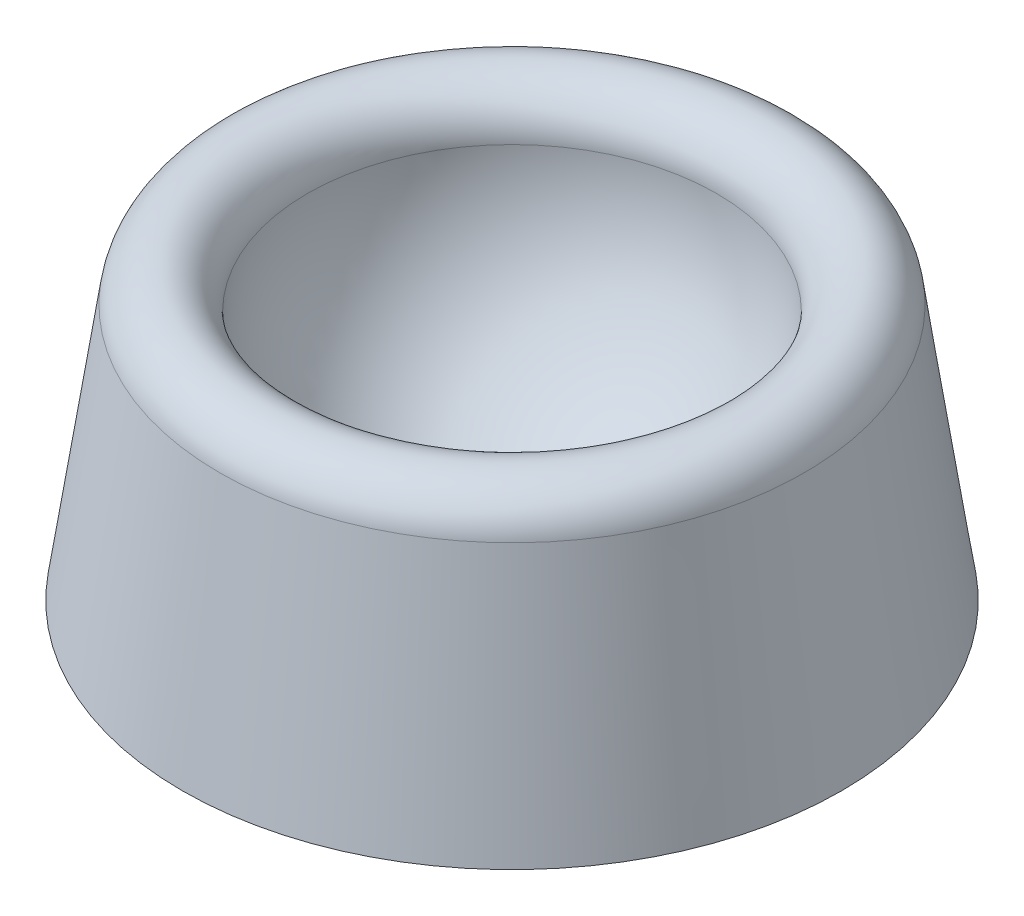
ISO-10303-21;
HEADER;
FILE_DESCRIPTION(('STEP AP214'),'2;1');
FILE_NAME('part.step','',(''),(''),'','','');
FILE_SCHEMA(('AUTOMOTIVE_DESIGN { 1 0 10303 214 1 1 1 1 }'));
ENDSEC;
DATA;
#1=APPLICATION_CONTEXT('core data for automotive mechanical design processes');
#2=APPLICATION_PROTOCOL_DEFINITION('international standard','automotive_design',2000,#1);
#3=PRODUCT_CONTEXT('',#1,'mechanical');
#4=PRODUCT('Part','Part','',(#3));
#5=PRODUCT_RELATED_PRODUCT_CATEGORY('part','',(#4));
#6=PRODUCT_DEFINITION_FORMATION('','',#4);
#7=PRODUCT_DEFINITION_CONTEXT('part definition',#1,'design');
#8=PRODUCT_DEFINITION('design','',#6,#7);
#9=PRODUCT_DEFINITION_SHAPE('','',#8);
#10=(LENGTH_UNIT() NAMED_UNIT(*) SI_UNIT(.MILLI.,.METRE.));
#11=(NAMED_UNIT(*) PLANE_ANGLE_UNIT() SI_UNIT($,.RADIAN.));
#12=(NAMED_UNIT(*) SI_UNIT($,.STERADIAN.) SOLID_ANGLE_UNIT());
#13=UNCERTAINTY_MEASURE_WITH_UNIT(LENGTH_MEASURE(1.E-05),#10,'distance_accuracy_value','');
#14=(GEOMETRIC_REPRESENTATION_CONTEXT(3) GLOBAL_UNCERTAINTY_ASSIGNED_CONTEXT((#13)) GLOBAL_UNIT_ASSIGNED_CONTEXT((#10,
#11,#12)) REPRESENTATION_CONTEXT('',''));
#15=CARTESIAN_POINT('',(0.,0.,0.));
#16=DIRECTION('',(0.,0.,1.));
#17=DIRECTION('',(1.,0.,0.));
#18=AXIS2_PLACEMENT_3D('',#15,#16,#17);
#19=CARTESIAN_POINT('',(0.,0.,0.));
#20=DIRECTION('',(0.,1.,0.));
#21=DIRECTION('',(0.,0.,1.));
#22=AXIS2_PLACEMENT_3D('',#19,#20,#21);
#23=TOROIDAL_SURFACE('',#22,10.9337608040576,1.93376080405758);
#24=CARTESIAN_POINT('',(0.,0.280359930332565,0.));
#25=DIRECTION('',(0.,1.,0.));
#26=DIRECTION('',(0.,0.,1.));
#27=AXIS2_PLACEMENT_3D('',#24,#25,#26);
#28=CIRCLE('',#27,12.8470901423507);
#29=CARTESIAN_POINT('',(0.,0.280359930332565,12.8470901423507));
#30=VERTEX_POINT('',#29);
#31=EDGE_CURVE('E10',#30,#30,#28,.T.);
#32=ORIENTED_EDGE('',*,*,#31,.T.);
#33=EDGE_LOOP('',(#32));
#34=FACE_BOUND('',#33,.T.);
#35=CARTESIAN_POINT('',(0.,0.,0.));
#36=DIRECTION('',(0.,1.,0.));
#37=DIRECTION('',(0.,0.,1.));
#38=AXIS2_PLACEMENT_3D('',#35,#36,#37);
#39=CIRCLE('',#38,9.);
#40=CARTESIAN_POINT('',(0.,0.,9.));
#41=VERTEX_POINT('',#40);
#42=EDGE_CURVE('E55',#41,#41,#39,.T.);
#43=ORIENTED_EDGE('',*,*,#42,.F.);
#44=EDGE_LOOP('',(#43));
#45=FACE_BOUND('',#44,.T.);
#46=ADVANCED_FACE('F33',(#34,#45),#23,.T.);
#47=CARTESIAN_POINT('',(0.,0.280359930332565,0.));
#48=DIRECTION('',(0.,-1.,0.));
#49=DIRECTION('',(0.,0.,-1.));
#50=AXIS2_PLACEMENT_3D('',#47,#48,#49);
#51=CONICAL_SURFACE('',#50,12.8470901423507,0.145494477881957);
#52=CARTESIAN_POINT('',(0.,-11.,0.));
#53=DIRECTION('',(0.,1.,0.));
#54=DIRECTION('',(0.,0.,1.));
#55=AXIS2_PLACEMENT_3D('',#52,#53,#54);
#56=CIRCLE('',#55,14.5);
#57=CARTESIAN_POINT('',(0.,-11.,14.5));
#58=VERTEX_POINT('',#57);
#59=EDGE_CURVE('E39',#58,#58,#56,.T.);
#60=ORIENTED_EDGE('',*,*,#59,.T.);
#61=EDGE_LOOP('',(#60));
#62=FACE_BOUND('',#61,.T.);
#63=ORIENTED_EDGE('',*,*,#31,.F.);
#64=EDGE_LOOP('',(#63));
#65=FACE_BOUND('',#64,.T.);
#66=ADVANCED_FACE('F62',(#62,#65),#51,.T.);
#67=CARTESIAN_POINT('',(-13.5,-11.,0.));
#68=DIRECTION('',(0.,-1.,0.));
#69=DIRECTION('',(0.,0.,-1.));
#70=AXIS2_PLACEMENT_3D('',#67,#68,#69);
#71=PLANE('',#70);
#72=CARTESIAN_POINT('',(0.,-11.,0.));
#73=DIRECTION('',(0.,1.,0.));
#74=DIRECTION('',(0.,0.,1.));
#75=AXIS2_PLACEMENT_3D('',#72,#73,#74);
#76=CIRCLE('',#75,13.5);
#77=CARTESIAN_POINT('',(0.,-11.,13.5));
#78=VERTEX_POINT('',#77);
#79=EDGE_CURVE('E43',#78,#78,#76,.T.);
#80=ORIENTED_EDGE('',*,*,#79,.T.);
#81=EDGE_LOOP('',(#80));
#82=FACE_BOUND('',#81,.T.);
#83=ORIENTED_EDGE('',*,*,#59,.F.);
#84=EDGE_LOOP('',(#83));
#85=FACE_BOUND('',#84,.T.);
#86=ADVANCED_FACE('F66',(#82,#85),#71,.T.);
#87=CARTESIAN_POINT('',(0.,-11.,0.));
#88=DIRECTION('',(0.,-1.,0.));
#89=DIRECTION('',(0.,0.,-1.));
#90=AXIS2_PLACEMENT_3D('',#87,#88,#89);
#91=CONICAL_SURFACE('',#90,13.5,0.146433124242317);
#92=CARTESIAN_POINT('',(0.,0.136245380437657,0.));
#93=DIRECTION('',(0.,1.,0.));
#94=DIRECTION('',(0.,0.,1.));
#95=AXIS2_PLACEMENT_3D('',#92,#93,#94);
#96=CIRCLE('',#95,11.8575283264915);
#97=CARTESIAN_POINT('',(0.,0.136245380437657,11.8575283264915));
#98=VERTEX_POINT('',#97);
#99=EDGE_CURVE('E47',#98,#98,#96,.T.);
#100=ORIENTED_EDGE('',*,*,#99,.T.);
#101=EDGE_LOOP('',(#100));
#102=FACE_BOUND('',#101,.T.);
#103=ORIENTED_EDGE('',*,*,#79,.F.);
#104=EDGE_LOOP('',(#103));
#105=FACE_BOUND('',#104,.T.);
#106=ADVANCED_FACE('F70',(#102,#105),#91,.F.);
#107=CARTESIAN_POINT('',(0.,0.,0.));
#108=DIRECTION('',(0.,1.,0.));
#109=DIRECTION('',(0.,0.,1.));
#110=AXIS2_PLACEMENT_3D('',#107,#108,#109);
#111=TOROIDAL_SURFACE('',#110,10.9337608040576,0.933760804057575);
#112=CARTESIAN_POINT('',(0.,0.,0.));
#113=DIRECTION('',(0.,1.,0.));
#114=DIRECTION('',(0.,0.,1.));
#115=AXIS2_PLACEMENT_3D('',#112,#113,#114);
#116=CIRCLE('',#115,10.);
#117=CARTESIAN_POINT('',(0.,0.,10.));
#118=VERTEX_POINT('',#117);
#119=EDGE_CURVE('E52',#118,#118,#116,.T.);
#120=ORIENTED_EDGE('',*,*,#119,.T.);
#121=EDGE_LOOP('',(#120));
#122=FACE_BOUND('',#121,.T.);
#123=ORIENTED_EDGE('',*,*,#99,.F.);
#124=EDGE_LOOP('',(#123));
#125=FACE_BOUND('',#124,.T.);
#126=ADVANCED_FACE('F77',(#122,#125),#111,.F.);
#127=CARTESIAN_POINT('',(0.,0.,0.));
#128=DIRECTION('',(0.,1.,0.));
#129=DIRECTION('',(-1.,0.,0.));
#130=AXIS2_PLACEMENT_3D('',#127,#128,#129);
#131=SPHERICAL_SURFACE('',#130,10.);
#132=ORIENTED_EDGE('',*,*,#119,.F.);
#133=EDGE_LOOP('',(#132));
#134=FACE_BOUND('',#133,.T.);
#135=ADVANCED_FACE('F81',(#134),#131,.T.);
#136=CARTESIAN_POINT('',(0.,0.,0.));
#137=DIRECTION('',(0.,1.,0.));
#138=DIRECTION('',(-1.,0.,0.));
#139=AXIS2_PLACEMENT_3D('',#136,#137,#138);
#140=SPHERICAL_SURFACE('',#139,9.);
#141=ORIENTED_EDGE('',*,*,#42,.T.);
#142=EDGE_LOOP('',(#141));
#143=FACE_BOUND('',#142,.T.);
#144=ADVANCED_FACE('F59',(#143),#140,.F.);
#145=CLOSED_SHELL('',(#46,#66,#86,#106,#126,#135,#144));
#146=MANIFOLD_SOLID_BREP('B2',#145);
#147=ADVANCED_BREP_SHAPE_REPRESENTATION('',(#18,#146),#14);
#148=SHAPE_DEFINITION_REPRESENTATION(#9,#147);
ENDSEC;
END-ISO-10303-21;
